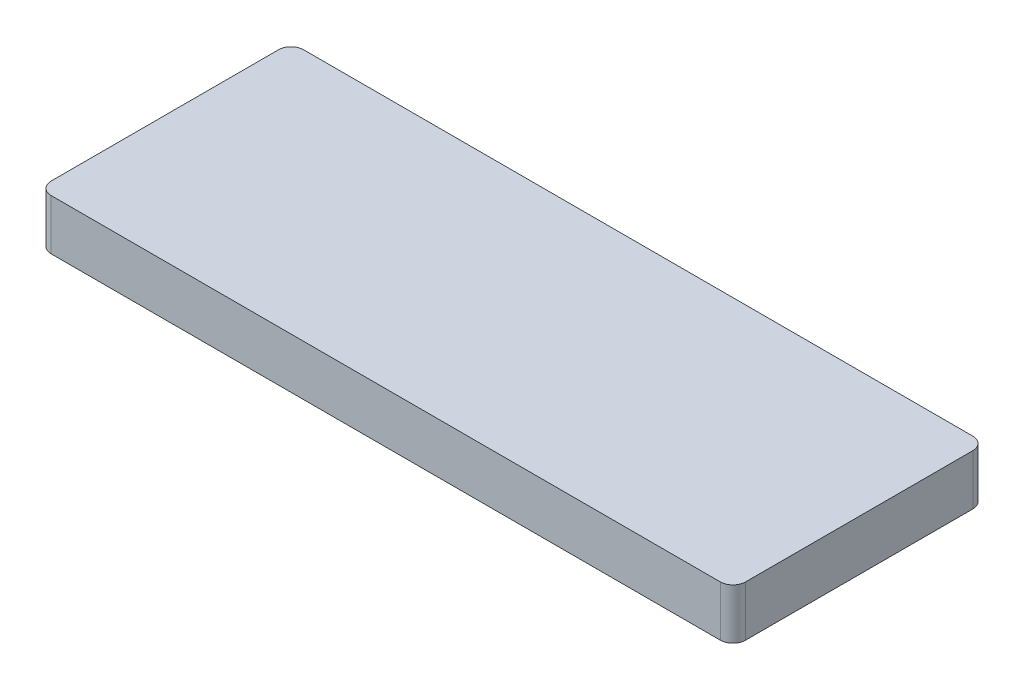
ISO-10303-21;
HEADER;
FILE_DESCRIPTION(('STEP AP214'),'2;1');
FILE_NAME('part.step','',(''),(''),'','','');
FILE_SCHEMA(('AUTOMOTIVE_DESIGN { 1 0 10303 214 1 1 1 1 }'));
ENDSEC;
DATA;
#1=APPLICATION_CONTEXT('core data for automotive mechanical design processes');
#2=APPLICATION_PROTOCOL_DEFINITION('international standard','automotive_design',2000,#1);
#3=PRODUCT_CONTEXT('',#1,'mechanical');
#4=PRODUCT('Part','Part','',(#3));
#5=PRODUCT_RELATED_PRODUCT_CATEGORY('part','',(#4));
#6=PRODUCT_DEFINITION_FORMATION('','',#4);
#7=PRODUCT_DEFINITION_CONTEXT('part definition',#1,'design');
#8=PRODUCT_DEFINITION('design','',#6,#7);
#9=PRODUCT_DEFINITION_SHAPE('','',#8);
#10=(LENGTH_UNIT() NAMED_UNIT(*) SI_UNIT(.MILLI.,.METRE.));
#11=(NAMED_UNIT(*) PLANE_ANGLE_UNIT() SI_UNIT($,.RADIAN.));
#12=(NAMED_UNIT(*) SI_UNIT($,.STERADIAN.) SOLID_ANGLE_UNIT());
#13=UNCERTAINTY_MEASURE_WITH_UNIT(LENGTH_MEASURE(1.E-05),#10,'distance_accuracy_value','');
#14=(GEOMETRIC_REPRESENTATION_CONTEXT(3) GLOBAL_UNCERTAINTY_ASSIGNED_CONTEXT((#13)) GLOBAL_UNIT_ASSIGNED_CONTEXT((#10,
#11,#12)) REPRESENTATION_CONTEXT('',''));
#15=CARTESIAN_POINT('',(0.,0.,0.));
#16=DIRECTION('',(0.,0.,1.));
#17=DIRECTION('',(1.,0.,0.));
#18=AXIS2_PLACEMENT_3D('',#15,#16,#17);
#19=CARTESIAN_POINT('',(0.,2.54,-12.7));
#20=DIRECTION('',(1.,0.,0.));
#21=DIRECTION('',(0.,0.,-1.));
#22=AXIS2_PLACEMENT_3D('',#19,#20,#21);
#23=PLANE('',#22);
#24=DIRECTION('',(0.,0.,1.));
#25=VECTOR('',#24,1.);
#26=CARTESIAN_POINT('',(0.,2.54,-12.7));
#27=LINE('',#26,#25);
#28=CARTESIAN_POINT('',(0.,2.54,-12.065));
#29=VERTEX_POINT('',#28);
#30=CARTESIAN_POINT('',(0.,2.54,-0.635));
#31=VERTEX_POINT('',#30);
#32=EDGE_CURVE('E172',#29,#31,#27,.T.);
#33=ORIENTED_EDGE('',*,*,#32,.F.);
#34=DIRECTION('',(0.,-1.,0.));
#35=VECTOR('',#34,1.);
#36=CARTESIAN_POINT('',(0.,2.54,-12.065));
#37=LINE('',#36,#35);
#38=CARTESIAN_POINT('',(0.,0.,-12.065));
#39=VERTEX_POINT('',#38);
#40=EDGE_CURVE('E197',#29,#39,#37,.T.);
#41=ORIENTED_EDGE('',*,*,#40,.T.);
#42=DIRECTION('',(0.,0.,1.));
#43=VECTOR('',#42,1.);
#44=CARTESIAN_POINT('',(0.,0.,-12.7));
#45=LINE('',#44,#43);
#46=CARTESIAN_POINT('',(0.,0.,-0.635));
#47=VERTEX_POINT('',#46);
#48=EDGE_CURVE('E185',#39,#47,#45,.T.);
#49=ORIENTED_EDGE('',*,*,#48,.T.);
#50=DIRECTION('',(0.,-1.,0.));
#51=VECTOR('',#50,1.);
#52=CARTESIAN_POINT('',(0.,2.54,-0.635));
#53=LINE('',#52,#51);
#54=EDGE_CURVE('E184',#47,#31,#53,.F.);
#55=ORIENTED_EDGE('',*,*,#54,.T.);
#56=EDGE_LOOP('',(#33,#41,#49,#55));
#57=FACE_BOUND('',#56,.T.);
#58=ADVANCED_FACE('F43',(#57),#23,.F.);
#59=CARTESIAN_POINT('',(0.,2.54,0.));
#60=DIRECTION('',(0.,0.,-1.));
#61=DIRECTION('',(-1.,0.,0.));
#62=AXIS2_PLACEMENT_3D('',#59,#60,#61);
#63=PLANE('',#62);
#64=DIRECTION('',(1.,0.,0.));
#65=VECTOR('',#64,1.);
#66=CARTESIAN_POINT('',(0.,0.,0.));
#67=LINE('',#66,#65);
#68=CARTESIAN_POINT('',(0.635,0.,0.));
#69=VERTEX_POINT('',#68);
#70=CARTESIAN_POINT('',(34.29,0.,0.));
#71=VERTEX_POINT('',#70);
#72=EDGE_CURVE('E188',#69,#71,#67,.T.);
#73=ORIENTED_EDGE('',*,*,#72,.T.);
#74=DIRECTION('',(0.,-1.,0.));
#75=VECTOR('',#74,1.);
#76=CARTESIAN_POINT('',(34.29,2.54,0.));
#77=LINE('',#76,#75);
#78=CARTESIAN_POINT('',(34.29,2.54,0.));
#79=VERTEX_POINT('',#78);
#80=EDGE_CURVE('E51',#71,#79,#77,.F.);
#81=ORIENTED_EDGE('',*,*,#80,.T.);
#82=DIRECTION('',(1.,0.,0.));
#83=VECTOR('',#82,1.);
#84=CARTESIAN_POINT('',(0.,2.54,0.));
#85=LINE('',#84,#83);
#86=CARTESIAN_POINT('',(0.635,2.54,0.));
#87=VERTEX_POINT('',#86);
#88=EDGE_CURVE('E175',#87,#79,#85,.T.);
#89=ORIENTED_EDGE('',*,*,#88,.F.);
#90=DIRECTION('',(0.,-1.,0.));
#91=VECTOR('',#90,1.);
#92=CARTESIAN_POINT('',(0.635,2.54,0.));
#93=LINE('',#92,#91);
#94=EDGE_CURVE('E225',#87,#69,#93,.T.);
#95=ORIENTED_EDGE('',*,*,#94,.T.);
#96=EDGE_LOOP('',(#73,#81,#89,#95));
#97=FACE_BOUND('',#96,.T.);
#98=ADVANCED_FACE('F230',(#97),#63,.F.);
#99=CARTESIAN_POINT('',(34.925,2.54,0.));
#100=DIRECTION('',(-1.,0.,0.));
#101=DIRECTION('',(0.,0.,1.));
#102=AXIS2_PLACEMENT_3D('',#99,#100,#101);
#103=PLANE('',#102);
#104=DIRECTION('',(0.,0.,-1.));
#105=VECTOR('',#104,1.);
#106=CARTESIAN_POINT('',(34.925,0.,0.));
#107=LINE('',#106,#105);
#108=CARTESIAN_POINT('',(34.925,0.,-0.635));
#109=VERTEX_POINT('',#108);
#110=CARTESIAN_POINT('',(34.925,0.,-12.065));
#111=VERTEX_POINT('',#110);
#112=EDGE_CURVE('E192',#109,#111,#107,.T.);
#113=ORIENTED_EDGE('',*,*,#112,.T.);
#114=DIRECTION('',(0.,-1.,0.));
#115=VECTOR('',#114,1.);
#116=CARTESIAN_POINT('',(34.925,2.54,-12.065));
#117=LINE('',#116,#115);
#118=CARTESIAN_POINT('',(34.925,2.54,-12.065));
#119=VERTEX_POINT('',#118);
#120=EDGE_CURVE('E66',#111,#119,#117,.F.);
#121=ORIENTED_EDGE('',*,*,#120,.T.);
#122=DIRECTION('',(0.,0.,-1.));
#123=VECTOR('',#122,1.);
#124=CARTESIAN_POINT('',(34.925,2.54,0.));
#125=LINE('',#124,#123);
#126=CARTESIAN_POINT('',(34.925,2.54,-0.635));
#127=VERTEX_POINT('',#126);
#128=EDGE_CURVE('E179',#127,#119,#125,.T.);
#129=ORIENTED_EDGE('',*,*,#128,.F.);
#130=DIRECTION('',(0.,-1.,0.));
#131=VECTOR('',#130,1.);
#132=CARTESIAN_POINT('',(34.925,2.54,-0.635));
#133=LINE('',#132,#131);
#134=EDGE_CURVE('E221',#127,#109,#133,.T.);
#135=ORIENTED_EDGE('',*,*,#134,.T.);
#136=EDGE_LOOP('',(#113,#121,#129,#135));
#137=FACE_BOUND('',#136,.T.);
#138=ADVANCED_FACE('F241',(#137),#103,.F.);
#139=CARTESIAN_POINT('',(34.925,2.54,-12.7));
#140=DIRECTION('',(0.,0.,1.));
#141=DIRECTION('',(1.,0.,0.));
#142=AXIS2_PLACEMENT_3D('',#139,#140,#141);
#143=PLANE('',#142);
#144=DIRECTION('',(-1.,0.,0.));
#145=VECTOR('',#144,1.);
#146=CARTESIAN_POINT('',(34.925,0.,-12.7));
#147=LINE('',#146,#145);
#148=CARTESIAN_POINT('',(34.29,0.,-12.7));
#149=VERTEX_POINT('',#148);
#150=CARTESIAN_POINT('',(0.634999999999997,0.,-12.7));
#151=VERTEX_POINT('',#150);
#152=EDGE_CURVE('E176',#149,#151,#147,.T.);
#153=ORIENTED_EDGE('',*,*,#152,.T.);
#154=DIRECTION('',(0.,-1.,0.));
#155=VECTOR('',#154,1.);
#156=CARTESIAN_POINT('',(0.634999999999997,2.54,-12.7));
#157=LINE('',#156,#155);
#158=CARTESIAN_POINT('',(0.634999999999997,2.54,-12.7));
#159=VERTEX_POINT('',#158);
#160=EDGE_CURVE('E211',#151,#159,#157,.F.);
#161=ORIENTED_EDGE('',*,*,#160,.T.);
#162=DIRECTION('',(-1.,0.,0.));
#163=VECTOR('',#162,1.);
#164=CARTESIAN_POINT('',(34.925,2.54,-12.7));
#165=LINE('',#164,#163);
#166=CARTESIAN_POINT('',(34.29,2.54,-12.7));
#167=VERTEX_POINT('',#166);
#168=EDGE_CURVE('E181',#167,#159,#165,.T.);
#169=ORIENTED_EDGE('',*,*,#168,.F.);
#170=DIRECTION('',(0.,-1.,0.));
#171=VECTOR('',#170,1.);
#172=CARTESIAN_POINT('',(34.29,2.54,-12.7));
#173=LINE('',#172,#171);
#174=EDGE_CURVE('E208',#167,#149,#173,.T.);
#175=ORIENTED_EDGE('',*,*,#174,.T.);
#176=EDGE_LOOP('',(#153,#161,#169,#175));
#177=FACE_BOUND('',#176,.T.);
#178=ADVANCED_FACE('F252',(#177),#143,.F.);
#179=CARTESIAN_POINT('',(0.,2.54,0.));
#180=DIRECTION('',(0.,1.,0.));
#181=DIRECTION('',(0.,0.,1.));
#182=AXIS2_PLACEMENT_3D('',#179,#180,#181);
#183=PLANE('',#182);
#184=ORIENTED_EDGE('',*,*,#168,.T.);
#185=CARTESIAN_POINT('',(0.634999999999995,2.54,-12.065));
#186=DIRECTION('',(0.,1.,0.));
#187=DIRECTION('',(0.,0.,1.));
#188=AXIS2_PLACEMENT_3D('',#185,#186,#187);
#189=CIRCLE('',#188,0.635);
#190=EDGE_CURVE('E219',#159,#29,#189,.T.);
#191=ORIENTED_EDGE('',*,*,#190,.T.);
#192=ORIENTED_EDGE('',*,*,#32,.T.);
#193=CARTESIAN_POINT('',(0.635,2.54,-0.635));
#194=DIRECTION('',(0.,1.,0.));
#195=DIRECTION('',(0.,0.,1.));
#196=AXIS2_PLACEMENT_3D('',#193,#194,#195);
#197=CIRCLE('',#196,0.635);
#198=EDGE_CURVE('E213',#31,#87,#197,.T.);
#199=ORIENTED_EDGE('',*,*,#198,.T.);
#200=ORIENTED_EDGE('',*,*,#88,.T.);
#201=CARTESIAN_POINT('',(34.29,2.54,-0.635));
#202=DIRECTION('',(0.,1.,0.));
#203=DIRECTION('',(0.,0.,1.));
#204=AXIS2_PLACEMENT_3D('',#201,#202,#203);
#205=CIRCLE('',#204,0.635);
#206=EDGE_CURVE('E215',#79,#127,#205,.T.);
#207=ORIENTED_EDGE('',*,*,#206,.T.);
#208=ORIENTED_EDGE('',*,*,#128,.T.);
#209=CARTESIAN_POINT('',(34.29,2.54,-12.065));
#210=DIRECTION('',(0.,1.,0.));
#211=DIRECTION('',(0.,0.,1.));
#212=AXIS2_PLACEMENT_3D('',#209,#210,#211);
#213=CIRCLE('',#212,0.635);
#214=EDGE_CURVE('E217',#119,#167,#213,.T.);
#215=ORIENTED_EDGE('',*,*,#214,.T.);
#216=EDGE_LOOP('',(#184,#191,#192,#199,#200,#207,#208,#215));
#217=FACE_BOUND('',#216,.T.);
#218=ADVANCED_FACE('F236',(#217),#183,.T.);
#219=CARTESIAN_POINT('',(0.,0.,0.));
#220=DIRECTION('',(0.,1.,0.));
#221=DIRECTION('',(0.,0.,1.));
#222=AXIS2_PLACEMENT_3D('',#219,#220,#221);
#223=PLANE('',#222);
#224=DIRECTION('',(-1.,0.,0.));
#225=VECTOR('',#224,1.);
#226=CARTESIAN_POINT('',(34.925,0.,-12.065));
#227=LINE('',#226,#225);
#228=CARTESIAN_POINT('',(34.29,0.,-12.065));
#229=VERTEX_POINT('',#228);
#230=CARTESIAN_POINT('',(0.634999999999995,0.,-12.065));
#231=VERTEX_POINT('',#230);
#232=EDGE_CURVE('E144',#229,#231,#227,.T.);
#233=ORIENTED_EDGE('',*,*,#232,.T.);
#234=DIRECTION('',(0.,0.,1.));
#235=VECTOR('',#234,1.);
#236=CARTESIAN_POINT('',(0.634999999999995,0.,-12.7));
#237=LINE('',#236,#235);
#238=CARTESIAN_POINT('',(0.635,0.,-0.635));
#239=VERTEX_POINT('',#238);
#240=EDGE_CURVE('E150',#231,#239,#237,.T.);
#241=ORIENTED_EDGE('',*,*,#240,.T.);
#242=DIRECTION('',(1.,0.,0.));
#243=VECTOR('',#242,1.);
#244=CARTESIAN_POINT('',(0.,0.,-0.635));
#245=LINE('',#244,#243);
#246=CARTESIAN_POINT('',(34.29,0.,-0.635));
#247=VERTEX_POINT('',#246);
#248=EDGE_CURVE('E166',#239,#247,#245,.T.);
#249=ORIENTED_EDGE('',*,*,#248,.T.);
#250=DIRECTION('',(0.,0.,-1.));
#251=VECTOR('',#250,1.);
#252=CARTESIAN_POINT('',(34.29,0.,0.));
#253=LINE('',#252,#251);
#254=EDGE_CURVE('E58',#247,#229,#253,.T.);
#255=ORIENTED_EDGE('',*,*,#254,.T.);
#256=EDGE_LOOP('',(#233,#241,#249,#255));
#257=FACE_BOUND('',#256,.T.);
#258=ORIENTED_EDGE('',*,*,#48,.F.);
#259=CARTESIAN_POINT('',(0.634999999999995,0.,-12.065));
#260=DIRECTION('',(0.,1.,0.));
#261=DIRECTION('',(0.,0.,1.));
#262=AXIS2_PLACEMENT_3D('',#259,#260,#261);
#263=CIRCLE('',#262,0.635);
#264=EDGE_CURVE('E206',#39,#151,#263,.F.);
#265=ORIENTED_EDGE('',*,*,#264,.T.);
#266=ORIENTED_EDGE('',*,*,#152,.F.);
#267=CARTESIAN_POINT('',(34.29,0.,-12.065));
#268=DIRECTION('',(0.,1.,0.));
#269=DIRECTION('',(0.,0.,1.));
#270=AXIS2_PLACEMENT_3D('',#267,#268,#269);
#271=CIRCLE('',#270,0.635);
#272=EDGE_CURVE('E204',#149,#111,#271,.F.);
#273=ORIENTED_EDGE('',*,*,#272,.T.);
#274=ORIENTED_EDGE('',*,*,#112,.F.);
#275=CARTESIAN_POINT('',(34.29,0.,-0.635));
#276=DIRECTION('',(0.,1.,0.));
#277=DIRECTION('',(0.,0.,1.));
#278=AXIS2_PLACEMENT_3D('',#275,#276,#277);
#279=CIRCLE('',#278,0.635);
#280=EDGE_CURVE('E202',#109,#71,#279,.F.);
#281=ORIENTED_EDGE('',*,*,#280,.T.);
#282=ORIENTED_EDGE('',*,*,#72,.F.);
#283=CARTESIAN_POINT('',(0.635,0.,-0.635));
#284=DIRECTION('',(0.,1.,0.));
#285=DIRECTION('',(0.,0.,1.));
#286=AXIS2_PLACEMENT_3D('',#283,#284,#285);
#287=CIRCLE('',#286,0.635);
#288=EDGE_CURVE('E200',#69,#47,#287,.F.);
#289=ORIENTED_EDGE('',*,*,#288,.T.);
#290=EDGE_LOOP('',(#258,#265,#266,#273,#274,#281,#282,#289));
#291=FACE_BOUND('',#290,.T.);
#292=ADVANCED_FACE('F244',(#257,#291),#223,.F.);
#293=CARTESIAN_POINT('',(0.634999999999995,2.54,-12.065));
#294=DIRECTION('',(0.,-1.,0.));
#295=DIRECTION('',(0.,0.,-1.));
#296=AXIS2_PLACEMENT_3D('',#293,#294,#295);
#297=CYLINDRICAL_SURFACE('',#296,0.635);
#298=ORIENTED_EDGE('',*,*,#190,.F.);
#299=ORIENTED_EDGE('',*,*,#160,.F.);
#300=ORIENTED_EDGE('',*,*,#264,.F.);
#301=ORIENTED_EDGE('',*,*,#40,.F.);
#302=EDGE_LOOP('',(#298,#299,#300,#301));
#303=FACE_BOUND('',#302,.T.);
#304=ADVANCED_FACE('F258',(#303),#297,.T.);
#305=CARTESIAN_POINT('',(34.29,2.54,-12.065));
#306=DIRECTION('',(0.,-1.,0.));
#307=DIRECTION('',(0.,0.,-1.));
#308=AXIS2_PLACEMENT_3D('',#305,#306,#307);
#309=CYLINDRICAL_SURFACE('',#308,0.635);
#310=ORIENTED_EDGE('',*,*,#214,.F.);
#311=ORIENTED_EDGE('',*,*,#120,.F.);
#312=ORIENTED_EDGE('',*,*,#272,.F.);
#313=ORIENTED_EDGE('',*,*,#174,.F.);
#314=EDGE_LOOP('',(#310,#311,#312,#313));
#315=FACE_BOUND('',#314,.T.);
#316=ADVANCED_FACE('F249',(#315),#309,.T.);
#317=CARTESIAN_POINT('',(34.29,2.54,-0.635));
#318=DIRECTION('',(0.,-1.,0.));
#319=DIRECTION('',(0.,0.,-1.));
#320=AXIS2_PLACEMENT_3D('',#317,#318,#319);
#321=CYLINDRICAL_SURFACE('',#320,0.635);
#322=ORIENTED_EDGE('',*,*,#206,.F.);
#323=ORIENTED_EDGE('',*,*,#80,.F.);
#324=ORIENTED_EDGE('',*,*,#280,.F.);
#325=ORIENTED_EDGE('',*,*,#134,.F.);
#326=EDGE_LOOP('',(#322,#323,#324,#325));
#327=FACE_BOUND('',#326,.T.);
#328=ADVANCED_FACE('F239',(#327),#321,.T.);
#329=CARTESIAN_POINT('',(0.635,2.54,-0.635));
#330=DIRECTION('',(0.,-1.,0.));
#331=DIRECTION('',(0.,0.,-1.));
#332=AXIS2_PLACEMENT_3D('',#329,#330,#331);
#333=CYLINDRICAL_SURFACE('',#332,0.635);
#334=ORIENTED_EDGE('',*,*,#198,.F.);
#335=ORIENTED_EDGE('',*,*,#54,.F.);
#336=ORIENTED_EDGE('',*,*,#288,.F.);
#337=ORIENTED_EDGE('',*,*,#94,.F.);
#338=EDGE_LOOP('',(#334,#335,#336,#337));
#339=FACE_BOUND('',#338,.T.);
#340=ADVANCED_FACE('F45',(#339),#333,.T.);
#341=CARTESIAN_POINT('',(0.634999999999995,2.54,-12.7));
#342=DIRECTION('',(1.,0.,0.));
#343=DIRECTION('',(0.,0.,-1.));
#344=AXIS2_PLACEMENT_3D('',#341,#342,#343);
#345=PLANE('',#344);
#346=DIRECTION('',(0.,0.,1.));
#347=VECTOR('',#346,1.);
#348=CARTESIAN_POINT('',(0.634999999999995,1.905,-12.7));
#349=LINE('',#348,#347);
#350=CARTESIAN_POINT('',(0.634999999999995,1.905,-12.065));
#351=VERTEX_POINT('',#350);
#352=CARTESIAN_POINT('',(0.635,1.905,-0.635));
#353=VERTEX_POINT('',#352);
#354=EDGE_CURVE('E134',#351,#353,#349,.T.);
#355=ORIENTED_EDGE('',*,*,#354,.T.);
#356=DIRECTION('',(0.,1.,0.));
#357=VECTOR('',#356,1.);
#358=CARTESIAN_POINT('',(0.635,2.54,-0.635));
#359=LINE('',#358,#357);
#360=EDGE_CURVE('E155',#239,#353,#359,.T.);
#361=ORIENTED_EDGE('',*,*,#360,.F.);
#362=ORIENTED_EDGE('',*,*,#240,.F.);
#363=DIRECTION('',(0.,1.,0.));
#364=VECTOR('',#363,1.);
#365=CARTESIAN_POINT('',(0.634999999999997,2.54,-12.065));
#366=LINE('',#365,#364);
#367=EDGE_CURVE('E147',#231,#351,#366,.T.);
#368=ORIENTED_EDGE('',*,*,#367,.T.);
#369=EDGE_LOOP('',(#355,#361,#362,#368));
#370=FACE_BOUND('',#369,.T.);
#371=ADVANCED_FACE('F148',(#370),#345,.T.);
#372=CARTESIAN_POINT('',(0.,2.54,-0.635));
#373=DIRECTION('',(0.,0.,-1.));
#374=DIRECTION('',(-1.,0.,0.));
#375=AXIS2_PLACEMENT_3D('',#372,#373,#374);
#376=PLANE('',#375);
#377=ORIENTED_EDGE('',*,*,#248,.F.);
#378=ORIENTED_EDGE('',*,*,#360,.T.);
#379=DIRECTION('',(1.,0.,0.));
#380=VECTOR('',#379,1.);
#381=CARTESIAN_POINT('',(0.,1.905,-0.635));
#382=LINE('',#381,#380);
#383=CARTESIAN_POINT('',(34.29,1.905,-0.635));
#384=VERTEX_POINT('',#383);
#385=EDGE_CURVE('E141',#353,#384,#382,.T.);
#386=ORIENTED_EDGE('',*,*,#385,.T.);
#387=DIRECTION('',(0.,1.,0.));
#388=VECTOR('',#387,1.);
#389=CARTESIAN_POINT('',(34.29,2.54,-0.635));
#390=LINE('',#389,#388);
#391=EDGE_CURVE('E189',#247,#384,#390,.T.);
#392=ORIENTED_EDGE('',*,*,#391,.F.);
#393=EDGE_LOOP('',(#377,#378,#386,#392));
#394=FACE_BOUND('',#393,.T.);
#395=ADVANCED_FACE('F267',(#394),#376,.T.);
#396=CARTESIAN_POINT('',(34.29,2.54,0.));
#397=DIRECTION('',(-1.,0.,0.));
#398=DIRECTION('',(0.,0.,1.));
#399=AXIS2_PLACEMENT_3D('',#396,#397,#398);
#400=PLANE('',#399);
#401=ORIENTED_EDGE('',*,*,#254,.F.);
#402=ORIENTED_EDGE('',*,*,#391,.T.);
#403=DIRECTION('',(0.,0.,-1.));
#404=VECTOR('',#403,1.);
#405=CARTESIAN_POINT('',(34.29,1.905,0.));
#406=LINE('',#405,#404);
#407=CARTESIAN_POINT('',(34.29,1.905,-12.065));
#408=VERTEX_POINT('',#407);
#409=EDGE_CURVE('E159',#384,#408,#406,.T.);
#410=ORIENTED_EDGE('',*,*,#409,.T.);
#411=DIRECTION('',(0.,1.,0.));
#412=VECTOR('',#411,1.);
#413=CARTESIAN_POINT('',(34.29,2.54,-12.065));
#414=LINE('',#413,#412);
#415=EDGE_CURVE('E154',#229,#408,#414,.T.);
#416=ORIENTED_EDGE('',*,*,#415,.F.);
#417=EDGE_LOOP('',(#401,#402,#410,#416));
#418=FACE_BOUND('',#417,.T.);
#419=ADVANCED_FACE('F319',(#418),#400,.T.);
#420=CARTESIAN_POINT('',(34.925,2.54,-12.065));
#421=DIRECTION('',(0.,0.,1.));
#422=DIRECTION('',(1.,0.,0.));
#423=AXIS2_PLACEMENT_3D('',#420,#421,#422);
#424=PLANE('',#423);
#425=ORIENTED_EDGE('',*,*,#232,.F.);
#426=ORIENTED_EDGE('',*,*,#415,.T.);
#427=DIRECTION('',(-1.,0.,0.));
#428=VECTOR('',#427,1.);
#429=CARTESIAN_POINT('',(34.925,1.905,-12.065));
#430=LINE('',#429,#428);
#431=EDGE_CURVE('E138',#408,#351,#430,.T.);
#432=ORIENTED_EDGE('',*,*,#431,.T.);
#433=ORIENTED_EDGE('',*,*,#367,.F.);
#434=EDGE_LOOP('',(#425,#426,#432,#433));
#435=FACE_BOUND('',#434,.T.);
#436=ADVANCED_FACE('F157',(#435),#424,.T.);
#437=CARTESIAN_POINT('',(0.,1.905,0.));
#438=DIRECTION('',(0.,1.,0.));
#439=DIRECTION('',(0.,0.,1.));
#440=AXIS2_PLACEMENT_3D('',#437,#438,#439);
#441=PLANE('',#440);
#442=CARTESIAN_POINT('',(17.4625,1.905,-6.35));
#443=DIRECTION('',(0.,1.,0.));
#444=DIRECTION('',(0.,0.,1.));
#445=AXIS2_PLACEMENT_3D('',#442,#443,#444);
#446=CIRCLE('',#445,2.54);
#447=CARTESIAN_POINT('',(17.4625,1.905,-3.81));
#448=VERTEX_POINT('',#447);
#449=EDGE_CURVE('E13',#448,#448,#446,.F.);
#450=ORIENTED_EDGE('',*,*,#449,.F.);
#451=EDGE_LOOP('',(#450));
#452=FACE_BOUND('',#451,.T.);
#453=ORIENTED_EDGE('',*,*,#431,.F.);
#454=ORIENTED_EDGE('',*,*,#409,.F.);
#455=ORIENTED_EDGE('',*,*,#385,.F.);
#456=ORIENTED_EDGE('',*,*,#354,.F.);
#457=EDGE_LOOP('',(#453,#454,#455,#456));
#458=FACE_BOUND('',#457,.T.);
#459=ADVANCED_FACE('F136',(#452,#458),#441,.F.);
#460=CARTESIAN_POINT('',(17.4625,-7.18420489685532,-6.35));
#461=DIRECTION('',(0.,1.,0.));
#462=DIRECTION('',(0.,0.,1.));
#463=AXIS2_PLACEMENT_3D('',#460,#461,#462);
#464=CYLINDRICAL_SURFACE('',#463,2.54);
#465=CARTESIAN_POINT('',(17.4625,0.,-6.35));
#466=DIRECTION('',(0.,1.,0.));
#467=DIRECTION('',(0.,0.,1.));
#468=AXIS2_PLACEMENT_3D('',#465,#466,#467);
#469=CIRCLE('',#468,2.54);
#470=CARTESIAN_POINT('',(17.4625,0.,-3.81));
#471=VERTEX_POINT('',#470);
#472=EDGE_CURVE('E167',#471,#471,#469,.T.);
#473=CARTESIAN_POINT('',(17.4625,0.,-3.81));
#474=CARTESIAN_POINT('',(17.4625,0.0198437499999991,-3.81));
#475=CARTESIAN_POINT('',(17.4625,0.0396874999999989,-3.81));
#476=CARTESIAN_POINT('',(17.4625,0.079374999999999,-3.81));
#477=CARTESIAN_POINT('',(17.4625,0.0992187499999992,-3.81));
#478=CARTESIAN_POINT('',(17.4625,0.138906249999999,-3.81));
#479=CARTESIAN_POINT('',(17.4625,0.158749999999999,-3.81));
#480=CARTESIAN_POINT('',(17.4625,0.198437499999999,-3.81));
#481=CARTESIAN_POINT('',(17.4625,0.218281249999999,-3.81));
#482=CARTESIAN_POINT('',(17.4625,0.25796875,-3.81));
#483=CARTESIAN_POINT('',(17.4625,0.277812499999999,-3.81));
#484=CARTESIAN_POINT('',(17.4625,0.317499999999999,-3.81));
#485=CARTESIAN_POINT('',(17.4625,0.337343749999999,-3.81));
#486=CARTESIAN_POINT('',(17.4625,0.377031249999999,-3.81));
#487=CARTESIAN_POINT('',(17.4625,0.396874999999999,-3.81));
#488=CARTESIAN_POINT('',(17.4625,0.436562499999999,-3.81));
#489=CARTESIAN_POINT('',(17.4625,0.456406249999999,-3.81));
#490=CARTESIAN_POINT('',(17.4625,0.496093749999999,-3.81));
#491=CARTESIAN_POINT('',(17.4625,0.515937499999999,-3.81));
#492=CARTESIAN_POINT('',(17.4625,0.555624999999999,-3.81));
#493=CARTESIAN_POINT('',(17.4625,0.575468749999999,-3.81));
#494=CARTESIAN_POINT('',(17.4625,0.615156249999999,-3.81));
#495=CARTESIAN_POINT('',(17.4625,0.634999999999999,-3.81));
#496=CARTESIAN_POINT('',(17.4625,0.674687499999998,-3.81));
#497=CARTESIAN_POINT('',(17.4625,0.694531249999998,-3.81));
#498=CARTESIAN_POINT('',(17.4625,0.734218749999998,-3.81));
#499=CARTESIAN_POINT('',(17.4625,0.754062499999998,-3.81));
#500=CARTESIAN_POINT('',(17.4625,0.793749999999998,-3.81));
#501=CARTESIAN_POINT('',(17.4625,0.813593749999999,-3.81));
#502=CARTESIAN_POINT('',(17.4625,0.853281249999999,-3.81));
#503=CARTESIAN_POINT('',(17.4625,0.873124999999999,-3.81));
#504=CARTESIAN_POINT('',(17.4625,0.912812499999999,-3.81));
#505=CARTESIAN_POINT('',(17.4625,0.932656249999999,-3.81));
#506=CARTESIAN_POINT('',(17.4625,0.972343749999998,-3.81));
#507=CARTESIAN_POINT('',(17.4625,0.992187499999998,-3.81));
#508=CARTESIAN_POINT('',(17.4625,1.031875,-3.81));
#509=CARTESIAN_POINT('',(17.4625,1.05171875,-3.81));
#510=CARTESIAN_POINT('',(17.4625,1.09140625,-3.81));
#511=CARTESIAN_POINT('',(17.4625,1.11125,-3.81));
#512=CARTESIAN_POINT('',(17.4625,1.1509375,-3.81));
#513=CARTESIAN_POINT('',(17.4625,1.17078125,-3.81));
#514=CARTESIAN_POINT('',(17.4625,1.21046875,-3.81));
#515=CARTESIAN_POINT('',(17.4625,1.2303125,-3.81));
#516=CARTESIAN_POINT('',(17.4625,1.27,-3.81));
#517=CARTESIAN_POINT('',(17.4625,1.28984375,-3.81));
#518=CARTESIAN_POINT('',(17.4625,1.32953125,-3.81));
#519=CARTESIAN_POINT('',(17.4625,1.349375,-3.81));
#520=CARTESIAN_POINT('',(17.4625,1.3890625,-3.81));
#521=CARTESIAN_POINT('',(17.4625,1.40890625,-3.81));
#522=CARTESIAN_POINT('',(17.4625,1.44859375,-3.81));
#523=CARTESIAN_POINT('',(17.4625,1.4684375,-3.81));
#524=CARTESIAN_POINT('',(17.4625,1.508125,-3.81));
#525=CARTESIAN_POINT('',(17.4625,1.52796875,-3.81));
#526=CARTESIAN_POINT('',(17.4625,1.56765625,-3.81));
#527=CARTESIAN_POINT('',(17.4625,1.5875,-3.81));
#528=CARTESIAN_POINT('',(17.4625,1.6271875,-3.81));
#529=CARTESIAN_POINT('',(17.4625,1.64703125,-3.81));
#530=CARTESIAN_POINT('',(17.4625,1.68671875,-3.81));
#531=CARTESIAN_POINT('',(17.4625,1.7065625,-3.81));
#532=CARTESIAN_POINT('',(17.4625,1.74625,-3.81));
#533=CARTESIAN_POINT('',(17.4625,1.76609375,-3.81));
#534=CARTESIAN_POINT('',(17.4625,1.80578125,-3.81));
#535=CARTESIAN_POINT('',(17.4625,1.825625,-3.81));
#536=CARTESIAN_POINT('',(17.4625,1.8653125,-3.81));
#537=CARTESIAN_POINT('',(17.4625,1.88515625,-3.81));
#538=CARTESIAN_POINT('',(17.4625,1.905,-3.81));
#539=B_SPLINE_CURVE_WITH_KNOTS('',3,(#473,#474,#475,#476,#477,#478,#479,#480,#481,#482,#483,
#484,#485,#486,#487,#488,#489,#490,#491,#492,#493,#494,#495,#496,#497,#498,#499,#500,#501,#502,
#503,#504,#505,#506,#507,#508,#509,#510,#511,#512,#513,#514,#515,#516,#517,#518,#519,#520,#521,
#522,#523,#524,#525,#526,#527,#528,#529,#530,#531,#532,#533,#534,#535,#536,#537,#538),
.UNSPECIFIED.,.F.,.F.,(4,2,2,2,2,2,2,2,2,2,2,2,2,2,2,2,2,2,2,2,2,2,2,2,2,2,2,2,2,2,2,2,4),(0.,
0.0595312499999997,0.1190625,0.17859375,0.238125,0.29765625,0.3571875,0.41671875,0.47625,
0.53578125,0.5953125,0.654843749999999,0.714374999999999,0.773906249999999,0.8334375,0.89296875,
0.952499999999999,1.01203125,1.0715625,1.13109375,1.190625,1.25015625,1.3096875,1.36921875,
1.42875,1.48828125,1.5478125,1.60734375,1.666875,1.72640625,1.7859375,1.84546875,1.905),.UNSPECIFIED.);
#540=EDGE_CURVE('BSEAM345',#471,#448,#539,.T.);
#541=ORIENTED_EDGE('',*,*,#472,.T.);
#542=ORIENTED_EDGE('',*,*,#449,.T.);
#543=ORIENTED_EDGE('',*,*,#540,.T.);
#544=ORIENTED_EDGE('',*,*,#540,.F.);
#545=EDGE_LOOP('',(#541,#543,#542,#544));
#546=FACE_BOUND('',#545,.T.);
#547=ADVANCED_FACE('F345',(#546),#464,.T.);
#548=CARTESIAN_POINT('',(0.,0.,0.));
#549=DIRECTION('',(0.,1.,0.));
#550=DIRECTION('',(0.,0.,1.));
#551=AXIS2_PLACEMENT_3D('',#548,#549,#550);
#552=PLANE('',#551);
#553=ORIENTED_EDGE('',*,*,#472,.F.);
#554=EDGE_LOOP('',(#553));
#555=FACE_BOUND('',#554,.T.);
#556=ADVANCED_FACE('F355',(#555),#552,.F.);
#557=CLOSED_SHELL('',(#58,#98,#138,#178,#218,#292,#304,#316,#328,#340,#371,#395,#419,#436,#459,
#547,#556));
#558=MANIFOLD_SOLID_BREP('B2',#557);
#559=ADVANCED_BREP_SHAPE_REPRESENTATION('',(#18,#558),#14);
#560=SHAPE_DEFINITION_REPRESENTATION(#9,#559);
ENDSEC;
END-ISO-10303-21;
